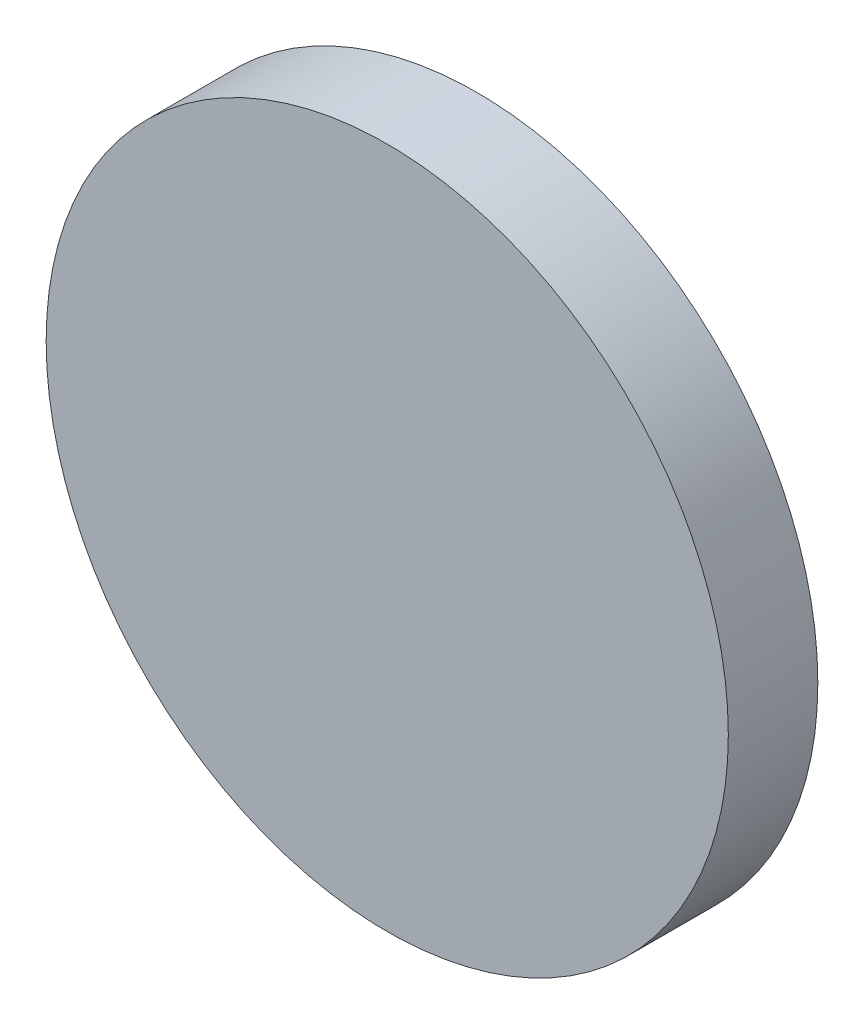
ISO-10303-21;
HEADER;
FILE_DESCRIPTION(('STEP AP214'),'2;1');
FILE_NAME('part.step','',(''),(''),'','','');
FILE_SCHEMA(('AUTOMOTIVE_DESIGN { 1 0 10303 214 1 1 1 1 }'));
ENDSEC;
DATA;
#1=APPLICATION_CONTEXT('core data for automotive mechanical design processes');
#2=APPLICATION_PROTOCOL_DEFINITION('international standard','automotive_design',2000,#1);
#3=PRODUCT_CONTEXT('',#1,'mechanical');
#4=PRODUCT('Part','Part','',(#3));
#5=PRODUCT_RELATED_PRODUCT_CATEGORY('part','',(#4));
#6=PRODUCT_DEFINITION_FORMATION('','',#4);
#7=PRODUCT_DEFINITION_CONTEXT('part definition',#1,'design');
#8=PRODUCT_DEFINITION('design','',#6,#7);
#9=PRODUCT_DEFINITION_SHAPE('','',#8);
#10=(LENGTH_UNIT() NAMED_UNIT(*) SI_UNIT(.MILLI.,.METRE.));
#11=(NAMED_UNIT(*) PLANE_ANGLE_UNIT() SI_UNIT($,.RADIAN.));
#12=(NAMED_UNIT(*) SI_UNIT($,.STERADIAN.) SOLID_ANGLE_UNIT());
#13=UNCERTAINTY_MEASURE_WITH_UNIT(LENGTH_MEASURE(1.E-05),#10,'distance_accuracy_value','');
#14=(GEOMETRIC_REPRESENTATION_CONTEXT(3) GLOBAL_UNCERTAINTY_ASSIGNED_CONTEXT((#13)) GLOBAL_UNIT_ASSIGNED_CONTEXT((#10,
#11,#12)) REPRESENTATION_CONTEXT('',''));
#15=CARTESIAN_POINT('',(0.,0.,0.));
#16=DIRECTION('',(0.,0.,1.));
#17=DIRECTION('',(1.,0.,0.));
#18=AXIS2_PLACEMENT_3D('',#15,#16,#17);
#19=CARTESIAN_POINT('',(0.,0.,10.));
#20=DIRECTION('',(0.,0.,-1.));
#21=DIRECTION('',(-1.,0.,0.));
#22=AXIS2_PLACEMENT_3D('',#19,#20,#21);
#23=CYLINDRICAL_SURFACE('',#22,38.1);
#24=CARTESIAN_POINT('',(0.,0.,10.));
#25=DIRECTION('',(0.,0.,1.));
#26=DIRECTION('',(1.,0.,0.));
#27=AXIS2_PLACEMENT_3D('',#24,#25,#26);
#28=CIRCLE('',#27,38.1);
#29=CARTESIAN_POINT('',(38.1,0.,10.));
#30=VERTEX_POINT('',#29);
#31=EDGE_CURVE('E10',#30,#30,#28,.T.);
#32=ORIENTED_EDGE('',*,*,#31,.F.);
#33=EDGE_LOOP('',(#32));
#34=FACE_BOUND('',#33,.T.);
#35=CARTESIAN_POINT('',(0.,0.,0.));
#36=DIRECTION('',(0.,0.,1.));
#37=DIRECTION('',(1.,0.,0.));
#38=AXIS2_PLACEMENT_3D('',#35,#36,#37);
#39=CIRCLE('',#38,38.1);
#40=CARTESIAN_POINT('',(38.1,0.,0.));
#41=VERTEX_POINT('',#40);
#42=EDGE_CURVE('E34',#41,#41,#39,.T.);
#43=ORIENTED_EDGE('',*,*,#42,.T.);
#44=EDGE_LOOP('',(#43));
#45=FACE_BOUND('',#44,.T.);
#46=ADVANCED_FACE('F31',(#34,#45),#23,.T.);
#47=CARTESIAN_POINT('',(0.,0.,10.));
#48=DIRECTION('',(0.,0.,1.));
#49=DIRECTION('',(1.,0.,0.));
#50=AXIS2_PLACEMENT_3D('',#47,#48,#49);
#51=PLANE('',#50);
#52=ORIENTED_EDGE('',*,*,#31,.T.);
#53=EDGE_LOOP('',(#52));
#54=FACE_BOUND('',#53,.T.);
#55=ADVANCED_FACE('F46',(#54),#51,.T.);
#56=CARTESIAN_POINT('',(0.,0.,0.));
#57=DIRECTION('',(0.,0.,1.));
#58=DIRECTION('',(1.,0.,0.));
#59=AXIS2_PLACEMENT_3D('',#56,#57,#58);
#60=PLANE('',#59);
#61=ORIENTED_EDGE('',*,*,#42,.F.);
#62=EDGE_LOOP('',(#61));
#63=FACE_BOUND('',#62,.T.);
#64=ADVANCED_FACE('F44',(#63),#60,.F.);
#65=CLOSED_SHELL('',(#46,#55,#64));
#66=MANIFOLD_SOLID_BREP('B2',#65);
#67=ADVANCED_BREP_SHAPE_REPRESENTATION('',(#18,#66),#14);
#68=SHAPE_DEFINITION_REPRESENTATION(#9,#67);
ENDSEC;
END-ISO-10303-21;
